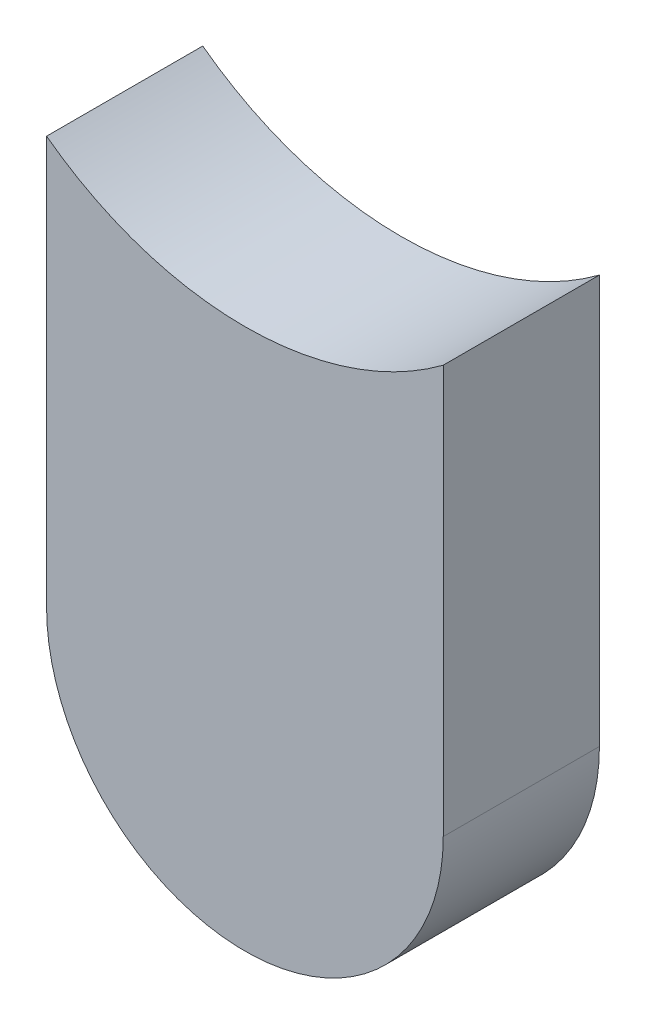
ISO-10303-21;
HEADER;
FILE_DESCRIPTION(('STEP AP214'),'2;1');
FILE_NAME('part.step','',(''),(''),'','','');
FILE_SCHEMA(('AUTOMOTIVE_DESIGN { 1 0 10303 214 1 1 1 1 }'));
ENDSEC;
DATA;
#1=APPLICATION_CONTEXT('core data for automotive mechanical design processes');
#2=APPLICATION_PROTOCOL_DEFINITION('international standard','automotive_design',2000,#1);
#3=PRODUCT_CONTEXT('',#1,'mechanical');
#4=PRODUCT('Part','Part','',(#3));
#5=PRODUCT_RELATED_PRODUCT_CATEGORY('part','',(#4));
#6=PRODUCT_DEFINITION_FORMATION('','',#4);
#7=PRODUCT_DEFINITION_CONTEXT('part definition',#1,'design');
#8=PRODUCT_DEFINITION('design','',#6,#7);
#9=PRODUCT_DEFINITION_SHAPE('','',#8);
#10=(LENGTH_UNIT() NAMED_UNIT(*) SI_UNIT(.MILLI.,.METRE.));
#11=(NAMED_UNIT(*) PLANE_ANGLE_UNIT() SI_UNIT($,.RADIAN.));
#12=(NAMED_UNIT(*) SI_UNIT($,.STERADIAN.) SOLID_ANGLE_UNIT());
#13=UNCERTAINTY_MEASURE_WITH_UNIT(LENGTH_MEASURE(1.E-05),#10,'distance_accuracy_value','');
#14=(GEOMETRIC_REPRESENTATION_CONTEXT(3) GLOBAL_UNCERTAINTY_ASSIGNED_CONTEXT((#13)) GLOBAL_UNIT_ASSIGNED_CONTEXT((#10,
#11,#12)) REPRESENTATION_CONTEXT('',''));
#15=CARTESIAN_POINT('',(0.,0.,0.));
#16=DIRECTION('',(0.,0.,1.));
#17=DIRECTION('',(1.,0.,0.));
#18=AXIS2_PLACEMENT_3D('',#15,#16,#17);
#19=CARTESIAN_POINT('',(104.521,114.3254,0.));
#20=DIRECTION('',(-1.,0.,0.));
#21=DIRECTION('',(0.,1.,0.));
#22=AXIS2_PLACEMENT_3D('',#19,#20,#21);
#23=PLANE('',#22);
#24=DIRECTION('',(0.,1.,0.));
#25=VECTOR('',#24,1.);
#26=CARTESIAN_POINT('',(104.521,114.3254,0.1999996));
#27=LINE('',#26,#25);
#28=CARTESIAN_POINT('',(104.521,114.3254,0.1999996));
#29=VERTEX_POINT('',#28);
#30=CARTESIAN_POINT('',(104.521,114.848251768897,0.1999996));
#31=VERTEX_POINT('',#30);
#32=EDGE_CURVE('E11',#29,#31,#27,.T.);
#33=ORIENTED_EDGE('',*,*,#32,.F.);
#34=DIRECTION('',(0.,0.,1.));
#35=VECTOR('',#34,1.);
#36=CARTESIAN_POINT('',(104.521,114.3254,0.));
#37=LINE('',#36,#35);
#38=CARTESIAN_POINT('',(104.521,114.3254,0.));
#39=VERTEX_POINT('',#38);
#40=EDGE_CURVE('E24',#39,#29,#37,.T.);
#41=ORIENTED_EDGE('',*,*,#40,.F.);
#42=DIRECTION('',(0.,1.,0.));
#43=VECTOR('',#42,1.);
#44=CARTESIAN_POINT('',(104.521,114.3254,0.));
#45=LINE('',#44,#43);
#46=CARTESIAN_POINT('',(104.521,114.848251768897,0.));
#47=VERTEX_POINT('',#46);
#48=EDGE_CURVE('E75',#39,#47,#45,.T.);
#49=ORIENTED_EDGE('',*,*,#48,.T.);
#50=DIRECTION('',(0.,0.,1.));
#51=VECTOR('',#50,1.);
#52=CARTESIAN_POINT('',(104.521,114.848251768897,0.));
#53=LINE('',#52,#51);
#54=EDGE_CURVE('E37',#47,#31,#53,.T.);
#55=ORIENTED_EDGE('',*,*,#54,.T.);
#56=EDGE_LOOP('',(#33,#41,#49,#55));
#57=FACE_BOUND('',#56,.T.);
#58=ADVANCED_FACE('F17',(#57),#23,.F.);
#59=CARTESIAN_POINT('',(104.267,115.189,0.));
#60=DIRECTION('',(0.,0.,-1.));
#61=DIRECTION('',(1.,0.,0.));
#62=AXIS2_PLACEMENT_3D('',#59,#60,#61);
#63=CYLINDRICAL_SURFACE('',#62,0.42500042);
#64=DIRECTION('',(0.,0.,1.));
#65=VECTOR('',#64,1.);
#66=CARTESIAN_POINT('',(104.013,114.848251768897,0.));
#67=LINE('',#66,#65);
#68=CARTESIAN_POINT('',(104.013,114.848251768897,0.));
#69=VERTEX_POINT('',#68);
#70=CARTESIAN_POINT('',(104.013,114.848251768897,0.1999996));
#71=VERTEX_POINT('',#70);
#72=EDGE_CURVE('E67',#69,#71,#67,.T.);
#73=ORIENTED_EDGE('',*,*,#72,.T.);
#74=CARTESIAN_POINT('',(104.267,115.189,0.1999996));
#75=DIRECTION('',(0.,0.,1.));
#76=DIRECTION('',(1.,0.,0.));
#77=AXIS2_PLACEMENT_3D('',#74,#75,#76);
#78=CIRCLE('',#77,0.42500042);
#79=EDGE_CURVE('E82',#71,#31,#78,.T.);
#80=ORIENTED_EDGE('',*,*,#79,.T.);
#81=ORIENTED_EDGE('',*,*,#54,.F.);
#82=CARTESIAN_POINT('',(104.267,115.189,0.));
#83=DIRECTION('',(0.,0.,1.));
#84=DIRECTION('',(1.,0.,0.));
#85=AXIS2_PLACEMENT_3D('',#82,#83,#84);
#86=CIRCLE('',#85,0.42500042);
#87=EDGE_CURVE('E80',#69,#47,#86,.T.);
#88=ORIENTED_EDGE('',*,*,#87,.F.);
#89=EDGE_LOOP('',(#73,#80,#81,#88));
#90=FACE_BOUND('',#89,.T.);
#91=ADVANCED_FACE('F88',(#90),#63,.F.);
#92=CARTESIAN_POINT('',(104.013,114.848251768897,0.));
#93=DIRECTION('',(1.,0.,0.));
#94=DIRECTION('',(0.,-1.,0.));
#95=AXIS2_PLACEMENT_3D('',#92,#93,#94);
#96=PLANE('',#95);
#97=DIRECTION('',(0.,-1.,0.));
#98=VECTOR('',#97,1.);
#99=CARTESIAN_POINT('',(104.013,115.189,0.1999996));
#100=LINE('',#99,#98);
#101=CARTESIAN_POINT('',(104.013,114.3254,0.1999996));
#102=VERTEX_POINT('',#101);
#103=EDGE_CURVE('E71',#71,#102,#100,.T.);
#104=ORIENTED_EDGE('',*,*,#103,.F.);
#105=ORIENTED_EDGE('',*,*,#72,.F.);
#106=DIRECTION('',(0.,-1.,0.));
#107=VECTOR('',#106,1.);
#108=CARTESIAN_POINT('',(104.013,115.189,0.));
#109=LINE('',#108,#107);
#110=CARTESIAN_POINT('',(104.013,114.3254,0.));
#111=VERTEX_POINT('',#110);
#112=EDGE_CURVE('E63',#69,#111,#109,.T.);
#113=ORIENTED_EDGE('',*,*,#112,.T.);
#114=DIRECTION('',(0.,0.,1.));
#115=VECTOR('',#114,1.);
#116=CARTESIAN_POINT('',(104.013,114.3254,0.));
#117=LINE('',#116,#115);
#118=EDGE_CURVE('E53',#111,#102,#117,.T.);
#119=ORIENTED_EDGE('',*,*,#118,.T.);
#120=EDGE_LOOP('',(#104,#105,#113,#119));
#121=FACE_BOUND('',#120,.T.);
#122=ADVANCED_FACE('F66',(#121),#96,.F.);
#123=CARTESIAN_POINT('',(104.267,114.3254,0.));
#124=DIRECTION('',(0.,0.,-1.));
#125=DIRECTION('',(-1.,0.,0.));
#126=AXIS2_PLACEMENT_3D('',#123,#124,#125);
#127=CYLINDRICAL_SURFACE('',#126,0.253999999999995);
#128=CARTESIAN_POINT('',(104.267,114.3254,0.1999996));
#129=DIRECTION('',(0.,0.,1.));
#130=DIRECTION('',(-1.,0.,0.));
#131=AXIS2_PLACEMENT_3D('',#128,#129,#130);
#132=CIRCLE('',#131,0.253999999999995);
#133=EDGE_CURVE('E59',#102,#29,#132,.T.);
#134=ORIENTED_EDGE('',*,*,#133,.F.);
#135=ORIENTED_EDGE('',*,*,#118,.F.);
#136=CARTESIAN_POINT('',(104.267,114.3254,0.));
#137=DIRECTION('',(0.,0.,1.));
#138=DIRECTION('',(-1.,0.,0.));
#139=AXIS2_PLACEMENT_3D('',#136,#137,#138);
#140=CIRCLE('',#139,0.253999999999995);
#141=EDGE_CURVE('E57',#111,#39,#140,.T.);
#142=ORIENTED_EDGE('',*,*,#141,.T.);
#143=ORIENTED_EDGE('',*,*,#40,.T.);
#144=EDGE_LOOP('',(#134,#135,#142,#143));
#145=FACE_BOUND('',#144,.T.);
#146=ADVANCED_FACE('F55',(#145),#127,.T.);
#147=CARTESIAN_POINT('',(104.521,114.3254,0.));
#148=DIRECTION('',(0.,0.,-1.));
#149=DIRECTION('',(-1.,0.,0.));
#150=AXIS2_PLACEMENT_3D('',#147,#148,#149);
#151=PLANE('',#150);
#152=ORIENTED_EDGE('',*,*,#48,.F.);
#153=ORIENTED_EDGE('',*,*,#141,.F.);
#154=ORIENTED_EDGE('',*,*,#112,.F.);
#155=ORIENTED_EDGE('',*,*,#87,.T.);
#156=EDGE_LOOP('',(#152,#153,#154,#155));
#157=FACE_BOUND('',#156,.T.);
#158=ADVANCED_FACE('F74',(#157),#151,.T.);
#159=CARTESIAN_POINT('',(104.521,114.3254,0.1999996));
#160=DIRECTION('',(0.,0.,-1.));
#161=DIRECTION('',(-1.,0.,0.));
#162=AXIS2_PLACEMENT_3D('',#159,#160,#161);
#163=PLANE('',#162);
#164=ORIENTED_EDGE('',*,*,#133,.T.);
#165=ORIENTED_EDGE('',*,*,#32,.T.);
#166=ORIENTED_EDGE('',*,*,#79,.F.);
#167=ORIENTED_EDGE('',*,*,#103,.T.);
#168=EDGE_LOOP('',(#164,#165,#166,#167));
#169=FACE_BOUND('',#168,.T.);
#170=ADVANCED_FACE('F91',(#169),#163,.F.);
#171=CLOSED_SHELL('',(#58,#91,#122,#146,#158,#170));
#172=MANIFOLD_SOLID_BREP('B1',#171);
#173=ADVANCED_BREP_SHAPE_REPRESENTATION('',(#18,#172),#14);
#174=SHAPE_DEFINITION_REPRESENTATION(#9,#173);
ENDSEC;
END-ISO-10303-21;
